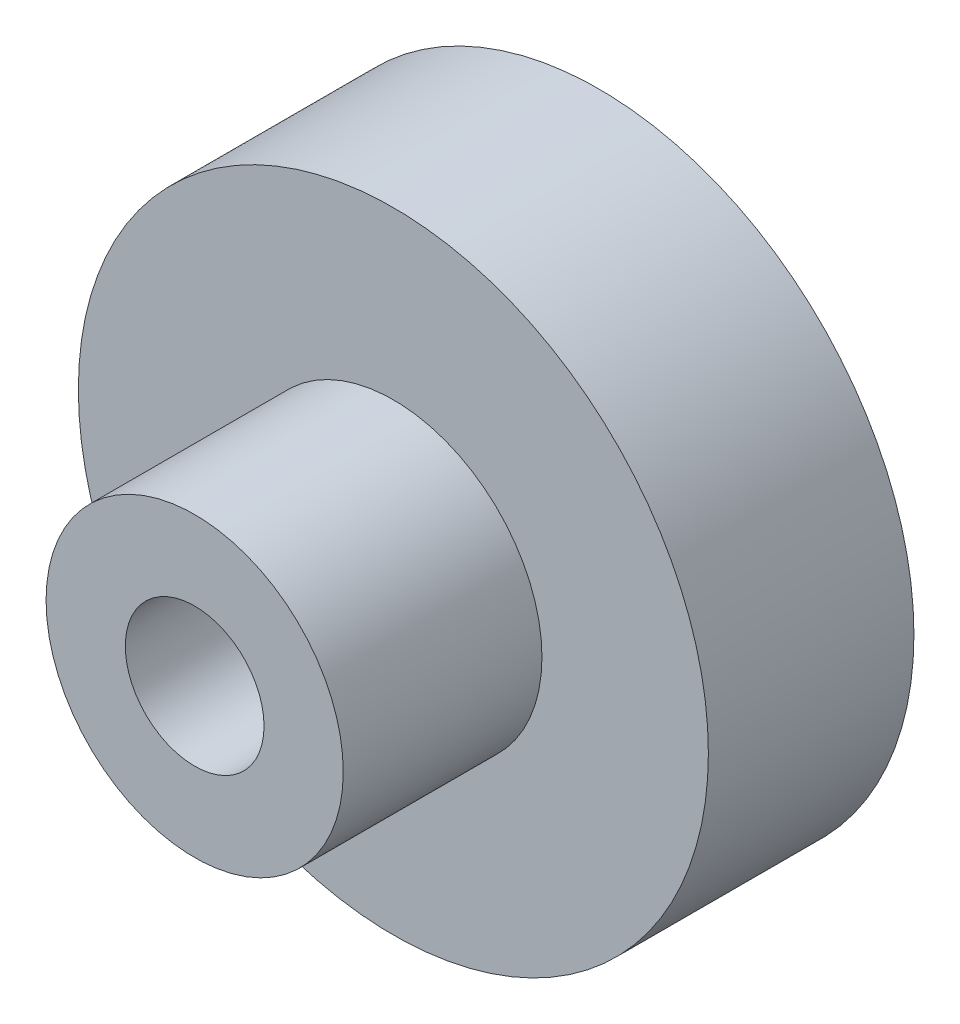
ISO-10303-21;
HEADER;
FILE_DESCRIPTION(('STEP AP214'),'2;1');
FILE_NAME('part.step','',(''),(''),'','','');
FILE_SCHEMA(('AUTOMOTIVE_DESIGN { 1 0 10303 214 1 1 1 1 }'));
ENDSEC;
DATA;
#1=APPLICATION_CONTEXT('core data for automotive mechanical design processes');
#2=APPLICATION_PROTOCOL_DEFINITION('international standard','automotive_design',2000,#1);
#3=PRODUCT_CONTEXT('',#1,'mechanical');
#4=PRODUCT('Part','Part','',(#3));
#5=PRODUCT_RELATED_PRODUCT_CATEGORY('part','',(#4));
#6=PRODUCT_DEFINITION_FORMATION('','',#4);
#7=PRODUCT_DEFINITION_CONTEXT('part definition',#1,'design');
#8=PRODUCT_DEFINITION('design','',#6,#7);
#9=PRODUCT_DEFINITION_SHAPE('','',#8);
#10=(LENGTH_UNIT() NAMED_UNIT(*) SI_UNIT(.MILLI.,.METRE.));
#11=(NAMED_UNIT(*) PLANE_ANGLE_UNIT() SI_UNIT($,.RADIAN.));
#12=(NAMED_UNIT(*) SI_UNIT($,.STERADIAN.) SOLID_ANGLE_UNIT());
#13=UNCERTAINTY_MEASURE_WITH_UNIT(LENGTH_MEASURE(1.E-05),#10,'distance_accuracy_value','');
#14=(GEOMETRIC_REPRESENTATION_CONTEXT(3) GLOBAL_UNCERTAINTY_ASSIGNED_CONTEXT((#13)) GLOBAL_UNIT_ASSIGNED_CONTEXT((#10,
#11,#12)) REPRESENTATION_CONTEXT('',''));
#15=CARTESIAN_POINT('',(0.,0.,0.));
#16=DIRECTION('',(0.,0.,1.));
#17=DIRECTION('',(1.,0.,0.));
#18=AXIS2_PLACEMENT_3D('',#15,#16,#17);
#19=CARTESIAN_POINT('',(0.,0.,6.));
#20=DIRECTION('',(0.,0.,-1.));
#21=DIRECTION('',(-1.,0.,0.));
#22=AXIS2_PLACEMENT_3D('',#19,#20,#21);
#23=CYLINDRICAL_SURFACE('',#22,18.39);
#24=CARTESIAN_POINT('',(0.,0.,6.));
#25=DIRECTION('',(0.,0.,1.));
#26=DIRECTION('',(1.,0.,0.));
#27=AXIS2_PLACEMENT_3D('',#24,#25,#26);
#28=CIRCLE('',#27,18.39);
#29=CARTESIAN_POINT('',(18.39,0.,6.));
#30=VERTEX_POINT('',#29);
#31=EDGE_CURVE('E10',#30,#30,#28,.T.);
#32=ORIENTED_EDGE('',*,*,#31,.F.);
#33=EDGE_LOOP('',(#32));
#34=FACE_BOUND('',#33,.T.);
#35=CARTESIAN_POINT('',(0.,0.,-6.));
#36=DIRECTION('',(0.,0.,1.));
#37=DIRECTION('',(1.,0.,0.));
#38=AXIS2_PLACEMENT_3D('',#35,#36,#37);
#39=CIRCLE('',#38,18.39);
#40=CARTESIAN_POINT('',(18.39,0.,-6.));
#41=VERTEX_POINT('',#40);
#42=EDGE_CURVE('E34',#41,#41,#39,.T.);
#43=ORIENTED_EDGE('',*,*,#42,.T.);
#44=EDGE_LOOP('',(#43));
#45=FACE_BOUND('',#44,.T.);
#46=ADVANCED_FACE('F31',(#34,#45),#23,.T.);
#47=CARTESIAN_POINT('',(0.,0.,6.));
#48=DIRECTION('',(0.,0.,1.));
#49=DIRECTION('',(1.,0.,0.));
#50=AXIS2_PLACEMENT_3D('',#47,#48,#49);
#51=PLANE('',#50);
#52=CARTESIAN_POINT('',(0.,0.,6.));
#53=DIRECTION('',(0.,0.,1.));
#54=DIRECTION('',(1.,0.,0.));
#55=AXIS2_PLACEMENT_3D('',#52,#53,#54);
#56=CIRCLE('',#55,8.675);
#57=CARTESIAN_POINT('',(8.675,0.,6.));
#58=VERTEX_POINT('',#57);
#59=EDGE_CURVE('E43',#58,#58,#56,.T.);
#60=ORIENTED_EDGE('',*,*,#59,.F.);
#61=EDGE_LOOP('',(#60));
#62=FACE_BOUND('',#61,.T.);
#63=ORIENTED_EDGE('',*,*,#31,.T.);
#64=EDGE_LOOP('',(#63));
#65=FACE_BOUND('',#64,.T.);
#66=ADVANCED_FACE('F71',(#62,#65),#51,.T.);
#67=CARTESIAN_POINT('',(0.,0.,-6.));
#68=DIRECTION('',(0.,0.,1.));
#69=DIRECTION('',(1.,0.,0.));
#70=AXIS2_PLACEMENT_3D('',#67,#68,#69);
#71=PLANE('',#70);
#72=CARTESIAN_POINT('',(0.,0.,-6.));
#73=DIRECTION('',(0.,0.,1.));
#74=DIRECTION('',(1.,0.,0.));
#75=AXIS2_PLACEMENT_3D('',#72,#73,#74);
#76=CIRCLE('',#75,4.05);
#77=CARTESIAN_POINT('',(4.05,0.,-6.));
#78=VERTEX_POINT('',#77);
#79=EDGE_CURVE('E46',#78,#78,#76,.T.);
#80=ORIENTED_EDGE('',*,*,#79,.T.);
#81=EDGE_LOOP('',(#80));
#82=FACE_BOUND('',#81,.T.);
#83=ORIENTED_EDGE('',*,*,#42,.F.);
#84=EDGE_LOOP('',(#83));
#85=FACE_BOUND('',#84,.T.);
#86=ADVANCED_FACE('F67',(#82,#85),#71,.F.);
#87=CARTESIAN_POINT('',(0.,0.,17.6));
#88=DIRECTION('',(0.,0.,-1.));
#89=DIRECTION('',(-1.,0.,0.));
#90=AXIS2_PLACEMENT_3D('',#87,#88,#89);
#91=CYLINDRICAL_SURFACE('',#90,8.675);
#92=CARTESIAN_POINT('',(0.,0.,17.6));
#93=DIRECTION('',(0.,0.,1.));
#94=DIRECTION('',(1.,0.,0.));
#95=AXIS2_PLACEMENT_3D('',#92,#93,#94);
#96=CIRCLE('',#95,8.675);
#97=CARTESIAN_POINT('',(8.675,0.,17.6));
#98=VERTEX_POINT('',#97);
#99=EDGE_CURVE('E41',#98,#98,#96,.T.);
#100=ORIENTED_EDGE('',*,*,#99,.F.);
#101=EDGE_LOOP('',(#100));
#102=FACE_BOUND('',#101,.T.);
#103=ORIENTED_EDGE('',*,*,#59,.T.);
#104=EDGE_LOOP('',(#103));
#105=FACE_BOUND('',#104,.T.);
#106=ADVANCED_FACE('F61',(#102,#105),#91,.T.);
#107=CARTESIAN_POINT('',(0.,0.,17.6));
#108=DIRECTION('',(0.,0.,1.));
#109=DIRECTION('',(1.,0.,0.));
#110=AXIS2_PLACEMENT_3D('',#107,#108,#109);
#111=PLANE('',#110);
#112=CARTESIAN_POINT('',(0.,0.,17.6));
#113=DIRECTION('',(0.,0.,1.));
#114=DIRECTION('',(1.,0.,0.));
#115=AXIS2_PLACEMENT_3D('',#112,#113,#114);
#116=CIRCLE('',#115,4.05);
#117=CARTESIAN_POINT('',(4.05,0.,17.6));
#118=VERTEX_POINT('',#117);
#119=EDGE_CURVE('E51',#118,#118,#116,.T.);
#120=ORIENTED_EDGE('',*,*,#119,.F.);
#121=EDGE_LOOP('',(#120));
#122=FACE_BOUND('',#121,.T.);
#123=ORIENTED_EDGE('',*,*,#99,.T.);
#124=EDGE_LOOP('',(#123));
#125=FACE_BOUND('',#124,.T.);
#126=ADVANCED_FACE('F58',(#122,#125),#111,.T.);
#127=CARTESIAN_POINT('',(0.,0.,-14.));
#128=DIRECTION('',(0.,0.,1.));
#129=DIRECTION('',(1.,0.,0.));
#130=AXIS2_PLACEMENT_3D('',#127,#128,#129);
#131=CYLINDRICAL_SURFACE('',#130,4.05);
#132=ORIENTED_EDGE('',*,*,#119,.T.);
#133=EDGE_LOOP('',(#132));
#134=FACE_BOUND('',#133,.T.);
#135=ORIENTED_EDGE('',*,*,#79,.F.);
#136=EDGE_LOOP('',(#135));
#137=FACE_BOUND('',#136,.T.);
#138=ADVANCED_FACE('F55',(#134,#137),#131,.F.);
#139=CLOSED_SHELL('',(#46,#66,#86,#106,#126,#138));
#140=MANIFOLD_SOLID_BREP('B2',#139);
#141=ADVANCED_BREP_SHAPE_REPRESENTATION('',(#18,#140),#14);
#142=SHAPE_DEFINITION_REPRESENTATION(#9,#141);
ENDSEC;
END-ISO-10303-21;
